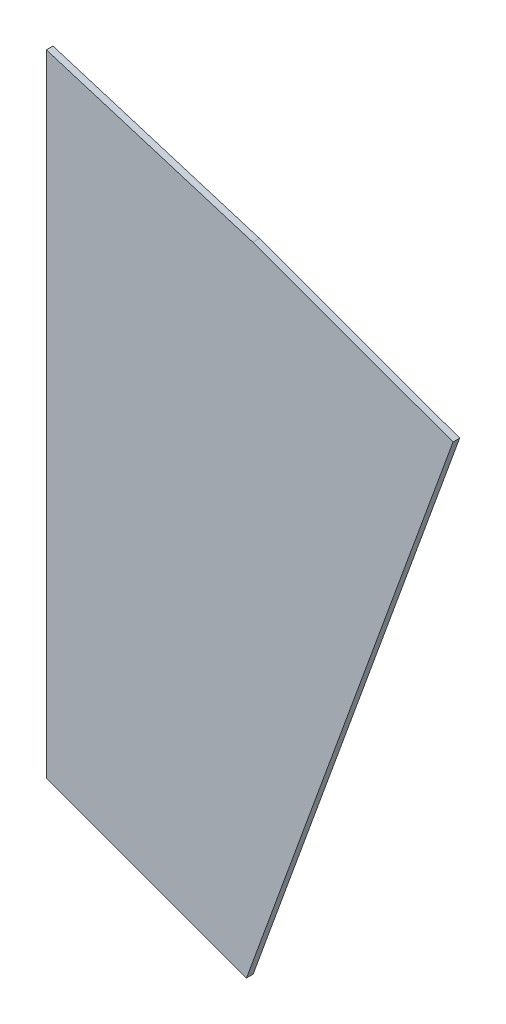
ISO-10303-21;
HEADER;
FILE_DESCRIPTION(('STEP AP214'),'2;1');
FILE_NAME('part.step','',(''),(''),'','','');
FILE_SCHEMA(('AUTOMOTIVE_DESIGN { 1 0 10303 214 1 1 1 1 }'));
ENDSEC;
DATA;
#1=APPLICATION_CONTEXT('core data for automotive mechanical design processes');
#2=APPLICATION_PROTOCOL_DEFINITION('international standard','automotive_design',2000,#1);
#3=PRODUCT_CONTEXT('',#1,'mechanical');
#4=PRODUCT('Part','Part','',(#3));
#5=PRODUCT_RELATED_PRODUCT_CATEGORY('part','',(#4));
#6=PRODUCT_DEFINITION_FORMATION('','',#4);
#7=PRODUCT_DEFINITION_CONTEXT('part definition',#1,'design');
#8=PRODUCT_DEFINITION('design','',#6,#7);
#9=PRODUCT_DEFINITION_SHAPE('','',#8);
#10=(LENGTH_UNIT() NAMED_UNIT(*) SI_UNIT(.MILLI.,.METRE.));
#11=(NAMED_UNIT(*) PLANE_ANGLE_UNIT() SI_UNIT($,.RADIAN.));
#12=(NAMED_UNIT(*) SI_UNIT($,.STERADIAN.) SOLID_ANGLE_UNIT());
#13=UNCERTAINTY_MEASURE_WITH_UNIT(LENGTH_MEASURE(1.E-05),#10,'distance_accuracy_value','');
#14=(GEOMETRIC_REPRESENTATION_CONTEXT(3) GLOBAL_UNCERTAINTY_ASSIGNED_CONTEXT((#13)) GLOBAL_UNIT_ASSIGNED_CONTEXT((#10,
#11,#12)) REPRESENTATION_CONTEXT('',''));
#15=CARTESIAN_POINT('',(0.,0.,0.));
#16=DIRECTION('',(0.,0.,1.));
#17=DIRECTION('',(1.,0.,0.));
#18=AXIS2_PLACEMENT_3D('',#15,#16,#17);
#19=CARTESIAN_POINT('',(0.,0.,1.6002));
#20=DIRECTION('',(0.34202014332567,0.939692620785908,0.));
#21=DIRECTION('',(-0.939692620785908,0.34202014332567,0.));
#22=AXIS2_PLACEMENT_3D('',#19,#20,#21);
#23=PLANE('',#22);
#24=DIRECTION('',(0.939692620785908,-0.34202014332567,0.));
#25=VECTOR('',#24,1.);
#26=CARTESIAN_POINT('',(0.,0.,0.));
#27=LINE('',#26,#25);
#28=CARTESIAN_POINT('',(0.,0.,0.));
#29=VERTEX_POINT('',#28);
#30=CARTESIAN_POINT('',(48.3555881072607,-17.5999947314797,0.));
#31=VERTEX_POINT('',#30);
#32=EDGE_CURVE('E106',#29,#31,#27,.T.);
#33=ORIENTED_EDGE('',*,*,#32,.T.);
#34=DIRECTION('',(0.,0.,-1.));
#35=VECTOR('',#34,1.);
#36=CARTESIAN_POINT('',(48.3555881072607,-17.5999947314797,1.6002));
#37=LINE('',#36,#35);
#38=CARTESIAN_POINT('',(48.3555881072607,-17.5999947314797,1.6002));
#39=VERTEX_POINT('',#38);
#40=EDGE_CURVE('E11',#39,#31,#37,.T.);
#41=ORIENTED_EDGE('',*,*,#40,.F.);
#42=DIRECTION('',(0.939692620785908,-0.34202014332567,0.));
#43=VECTOR('',#42,1.);
#44=CARTESIAN_POINT('',(0.,0.,1.6002));
#45=LINE('',#44,#43);
#46=CARTESIAN_POINT('',(0.,0.,1.6002));
#47=VERTEX_POINT('',#46);
#48=EDGE_CURVE('E114',#47,#39,#45,.T.);
#49=ORIENTED_EDGE('',*,*,#48,.F.);
#50=DIRECTION('',(0.,0.,-1.));
#51=VECTOR('',#50,1.);
#52=CARTESIAN_POINT('',(0.,0.,1.6002));
#53=LINE('',#52,#51);
#54=EDGE_CURVE('E102',#47,#29,#53,.T.);
#55=ORIENTED_EDGE('',*,*,#54,.T.);
#56=EDGE_LOOP('',(#33,#41,#49,#55));
#57=FACE_BOUND('',#56,.T.);
#58=ADVANCED_FACE('F32',(#57),#23,.F.);
#59=CARTESIAN_POINT('',(48.3555881072607,-17.5999947314797,1.6002));
#60=DIRECTION('',(-0.939692620785927,0.342020143325619,0.));
#61=DIRECTION('',(-0.342020143325619,-0.939692620785927,0.));
#62=AXIS2_PLACEMENT_3D('',#59,#60,#61);
#63=PLANE('',#62);
#64=DIRECTION('',(0.342020143325619,0.939692620785927,0.));
#65=VECTOR('',#64,1.);
#66=CARTESIAN_POINT('',(48.3555881072607,-17.5999947314797,0.));
#67=LINE('',#66,#65);
#68=CARTESIAN_POINT('',(98.2518430882906,119.488839144273,0.));
#69=VERTEX_POINT('',#68);
#70=EDGE_CURVE('E109',#31,#69,#67,.T.);
#71=ORIENTED_EDGE('',*,*,#70,.T.);
#72=DIRECTION('',(0.,0.,-1.));
#73=VECTOR('',#72,1.);
#74=CARTESIAN_POINT('',(98.2518430882906,119.488839144273,1.6002));
#75=LINE('',#74,#73);
#76=CARTESIAN_POINT('',(98.2518430882906,119.488839144273,1.6002));
#77=VERTEX_POINT('',#76);
#78=EDGE_CURVE('E40',#77,#69,#75,.T.);
#79=ORIENTED_EDGE('',*,*,#78,.F.);
#80=DIRECTION('',(0.342020143325619,0.939692620785927,0.));
#81=VECTOR('',#80,1.);
#82=CARTESIAN_POINT('',(48.3555881072607,-17.5999947314797,1.6002));
#83=LINE('',#82,#81);
#84=EDGE_CURVE('E82',#39,#77,#83,.T.);
#85=ORIENTED_EDGE('',*,*,#84,.F.);
#86=ORIENTED_EDGE('',*,*,#40,.T.);
#87=EDGE_LOOP('',(#71,#79,#85,#86));
#88=FACE_BOUND('',#87,.T.);
#89=ADVANCED_FACE('F133',(#88),#63,.F.);
#90=CARTESIAN_POINT('',(98.2518430882906,119.488839144273,1.6002));
#91=DIRECTION('',(-0.342020143325619,-0.939692620785927,0.));
#92=DIRECTION('',(0.939692620785927,-0.342020143325619,0.));
#93=AXIS2_PLACEMENT_3D('',#90,#91,#92);
#94=PLANE('',#93);
#95=DIRECTION('',(-0.939692620785927,0.342020143325618,0.));
#96=VECTOR('',#95,1.);
#97=CARTESIAN_POINT('',(98.2518430882906,119.488839144273,0.));
#98=LINE('',#97,#96);
#99=CARTESIAN_POINT('',(49.8962549810363,137.088833875747,0.));
#100=VERTEX_POINT('',#99);
#101=EDGE_CURVE('E97',#69,#100,#98,.T.);
#102=ORIENTED_EDGE('',*,*,#101,.T.);
#103=DIRECTION('',(0.,0.,-1.));
#104=VECTOR('',#103,1.);
#105=CARTESIAN_POINT('',(49.8962549810363,137.088833875747,1.6002));
#106=LINE('',#105,#104);
#107=CARTESIAN_POINT('',(49.8962549810363,137.088833875747,1.6002));
#108=VERTEX_POINT('',#107);
#109=EDGE_CURVE('E94',#108,#100,#106,.T.);
#110=ORIENTED_EDGE('',*,*,#109,.F.);
#111=DIRECTION('',(-0.939692620785927,0.342020143325618,0.));
#112=VECTOR('',#111,1.);
#113=CARTESIAN_POINT('',(98.2518430882906,119.488839144273,1.6002));
#114=LINE('',#113,#112);
#115=EDGE_CURVE('E86',#77,#108,#114,.T.);
#116=ORIENTED_EDGE('',*,*,#115,.F.);
#117=ORIENTED_EDGE('',*,*,#78,.T.);
#118=EDGE_LOOP('',(#102,#110,#116,#117));
#119=FACE_BOUND('',#118,.T.);
#120=ADVANCED_FACE('F95',(#119),#94,.F.);
#121=CARTESIAN_POINT('',(49.8962549810363,137.088833875747,1.6002));
#122=DIRECTION('',(-0.293358915053622,-0.956002378113445,0.));
#123=DIRECTION('',(0.956002378113445,-0.293358915053622,0.));
#124=AXIS2_PLACEMENT_3D('',#121,#122,#123);
#125=PLANE('',#124);
#126=DIRECTION('',(-0.956002378113445,0.293358915053622,0.));
#127=VECTOR('',#126,1.);
#128=CARTESIAN_POINT('',(49.8962549810363,137.088833875747,0.));
#129=LINE('',#128,#127);
#130=CARTESIAN_POINT('',(0.,152.4,0.));
#131=VERTEX_POINT('',#130);
#132=EDGE_CURVE('E68',#100,#131,#129,.T.);
#133=ORIENTED_EDGE('',*,*,#132,.T.);
#134=DIRECTION('',(0.,0.,-1.));
#135=VECTOR('',#134,1.);
#136=CARTESIAN_POINT('',(0.,152.4,1.6002));
#137=LINE('',#136,#135);
#138=CARTESIAN_POINT('',(0.,152.4,1.6002));
#139=VERTEX_POINT('',#138);
#140=EDGE_CURVE('E98',#139,#131,#137,.T.);
#141=ORIENTED_EDGE('',*,*,#140,.F.);
#142=DIRECTION('',(-0.956002378113445,0.293358915053622,0.));
#143=VECTOR('',#142,1.);
#144=CARTESIAN_POINT('',(49.8962549810363,137.088833875747,1.6002));
#145=LINE('',#144,#143);
#146=EDGE_CURVE('E90',#108,#139,#145,.T.);
#147=ORIENTED_EDGE('',*,*,#146,.F.);
#148=ORIENTED_EDGE('',*,*,#109,.T.);
#149=EDGE_LOOP('',(#133,#141,#147,#148));
#150=FACE_BOUND('',#149,.T.);
#151=ADVANCED_FACE('F100',(#150),#125,.F.);
#152=CARTESIAN_POINT('',(0.,0.,1.6002));
#153=DIRECTION('',(1.,0.,0.));
#154=DIRECTION('',(0.,0.,-1.));
#155=AXIS2_PLACEMENT_3D('',#152,#153,#154);
#156=PLANE('',#155);
#157=DIRECTION('',(0.,-1.,0.));
#158=VECTOR('',#157,1.);
#159=CARTESIAN_POINT('',(0.,0.,0.));
#160=LINE('',#159,#158);
#161=EDGE_CURVE('E74',#131,#29,#160,.T.);
#162=ORIENTED_EDGE('',*,*,#161,.T.);
#163=ORIENTED_EDGE('',*,*,#54,.F.);
#164=DIRECTION('',(0.,-1.,0.));
#165=VECTOR('',#164,1.);
#166=CARTESIAN_POINT('',(0.,0.,1.6002));
#167=LINE('',#166,#165);
#168=EDGE_CURVE('E48',#139,#47,#167,.T.);
#169=ORIENTED_EDGE('',*,*,#168,.F.);
#170=ORIENTED_EDGE('',*,*,#140,.T.);
#171=EDGE_LOOP('',(#162,#163,#169,#170));
#172=FACE_BOUND('',#171,.T.);
#173=ADVANCED_FACE('F122',(#172),#156,.F.);
#174=CARTESIAN_POINT('',(0.,0.,1.6002));
#175=DIRECTION('',(0.,0.,1.));
#176=DIRECTION('',(1.,0.,0.));
#177=AXIS2_PLACEMENT_3D('',#174,#175,#176);
#178=PLANE('',#177);
#179=ORIENTED_EDGE('',*,*,#48,.T.);
#180=ORIENTED_EDGE('',*,*,#84,.T.);
#181=ORIENTED_EDGE('',*,*,#115,.T.);
#182=ORIENTED_EDGE('',*,*,#146,.T.);
#183=ORIENTED_EDGE('',*,*,#168,.T.);
#184=EDGE_LOOP('',(#179,#180,#181,#182,#183));
#185=FACE_BOUND('',#184,.T.);
#186=ADVANCED_FACE('F88',(#185),#178,.T.);
#187=CARTESIAN_POINT('',(0.,0.,0.));
#188=DIRECTION('',(0.,0.,1.));
#189=DIRECTION('',(1.,0.,0.));
#190=AXIS2_PLACEMENT_3D('',#187,#188,#189);
#191=PLANE('',#190);
#192=ORIENTED_EDGE('',*,*,#32,.F.);
#193=ORIENTED_EDGE('',*,*,#161,.F.);
#194=ORIENTED_EDGE('',*,*,#132,.F.);
#195=ORIENTED_EDGE('',*,*,#101,.F.);
#196=ORIENTED_EDGE('',*,*,#70,.F.);
#197=EDGE_LOOP('',(#192,#193,#194,#195,#196));
#198=FACE_BOUND('',#197,.T.);
#199=ADVANCED_FACE('F118',(#198),#191,.F.);
#200=CLOSED_SHELL('',(#58,#89,#120,#151,#173,#186,#199));
#201=MANIFOLD_SOLID_BREP('B2',#200);
#202=ADVANCED_BREP_SHAPE_REPRESENTATION('',(#18,#201),#14);
#203=SHAPE_DEFINITION_REPRESENTATION(#9,#202);
ENDSEC;
END-ISO-10303-21;
